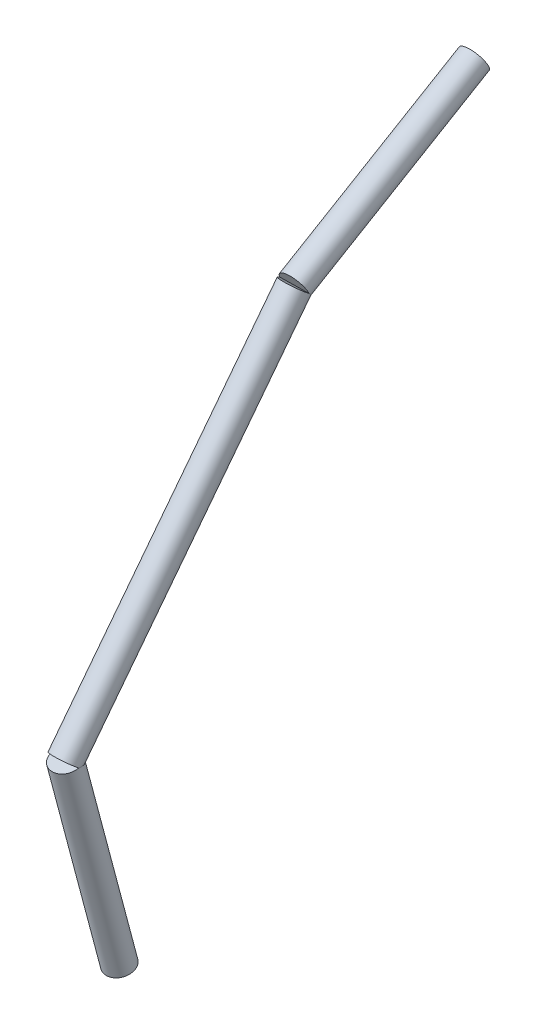
ISO-10303-21;
HEADER;
FILE_DESCRIPTION(('STEP AP214'),'2;1');
FILE_NAME('part.step','',(''),(''),'','','');
FILE_SCHEMA(('AUTOMOTIVE_DESIGN { 1 0 10303 214 1 1 1 1 }'));
ENDSEC;
DATA;
#1=APPLICATION_CONTEXT('core data for automotive mechanical design processes');
#2=APPLICATION_PROTOCOL_DEFINITION('international standard','automotive_design',2000,#1);
#3=PRODUCT_CONTEXT('',#1,'mechanical');
#4=PRODUCT('Part','Part','',(#3));
#5=PRODUCT_RELATED_PRODUCT_CATEGORY('part','',(#4));
#6=PRODUCT_DEFINITION_FORMATION('','',#4);
#7=PRODUCT_DEFINITION_CONTEXT('part definition',#1,'design');
#8=PRODUCT_DEFINITION('design','',#6,#7);
#9=PRODUCT_DEFINITION_SHAPE('','',#8);
#10=(LENGTH_UNIT() NAMED_UNIT(*) SI_UNIT(.MILLI.,.METRE.));
#11=(NAMED_UNIT(*) PLANE_ANGLE_UNIT() SI_UNIT($,.RADIAN.));
#12=(NAMED_UNIT(*) SI_UNIT($,.STERADIAN.) SOLID_ANGLE_UNIT());
#13=UNCERTAINTY_MEASURE_WITH_UNIT(LENGTH_MEASURE(1.E-05),#10,'distance_accuracy_value','');
#14=(GEOMETRIC_REPRESENTATION_CONTEXT(3) GLOBAL_UNCERTAINTY_ASSIGNED_CONTEXT((#13)) GLOBAL_UNIT_ASSIGNED_CONTEXT((#10,
#11,#12)) REPRESENTATION_CONTEXT('',''));
#15=CARTESIAN_POINT('',(0.,0.,0.));
#16=DIRECTION('',(0.,0.,1.));
#17=DIRECTION('',(1.,0.,0.));
#18=AXIS2_PLACEMENT_3D('',#15,#16,#17);
#19=CARTESIAN_POINT('',(0.,24.,70.));
#20=DIRECTION('',(0.0420048852601261,-0.458598241639988,0.887650405497004));
#21=DIRECTION('',(0.,-0.88843453308903,-0.459003355559497));
#22=AXIS2_PLACEMENT_3D('',#19,#20,#21);
#23=PLANE('',#22);
#24=CARTESIAN_POINT('',(0.,24.,70.));
#25=DIRECTION('',(-0.0420048852601261,0.458598241639988,-0.887650405497004));
#26=DIRECTION('',(0.,0.88843453308903,0.459003355559497));
#27=AXIS2_PLACEMENT_3D('',#24,#25,#26);
#28=CIRCLE('',#27,2.);
#29=CARTESIAN_POINT('',(0.,22.2231309338219,69.081993288881));
#30=VERTEX_POINT('',#29);
#31=EDGE_CURVE('P0_E10',#30,#30,#28,.T.);
#32=ORIENTED_EDGE('',*,*,#31,.F.);
#33=EDGE_LOOP('',(#32));
#34=FACE_BOUND('',#33,.T.);
#35=ADVANCED_FACE('P0_F15',(#34),#23,.T.);
#36=CARTESIAN_POINT('',(-1.325,38.466,42.));
#37=DIRECTION('',(-0.0420048852601261,0.458598241639988,-0.887650405497004));
#38=DIRECTION('',(0.,0.88843453308903,0.459003355559497));
#39=AXIS2_PLACEMENT_3D('',#36,#37,#38);
#40=PLANE('',#39);
#41=CARTESIAN_POINT('',(-1.325,38.466,42.));
#42=DIRECTION('',(0.0420048852601261,-0.458598241639988,0.887650405497004));
#43=DIRECTION('',(0.,-0.88843453308903,-0.459003355559497));
#44=AXIS2_PLACEMENT_3D('',#41,#42,#43);
#45=CIRCLE('',#44,2.);
#46=CARTESIAN_POINT('',(-1.325,36.6891309338219,41.081993288881));
#47=VERTEX_POINT('',#46);
#48=EDGE_CURVE('P0_E22',#47,#47,#45,.T.);
#49=ORIENTED_EDGE('',*,*,#48,.F.);
#50=EDGE_LOOP('',(#49));
#51=FACE_BOUND('',#50,.T.);
#52=ADVANCED_FACE('P0_F26',(#51),#40,.T.);
#53=CARTESIAN_POINT('',(-1.325,38.466,42.));
#54=DIRECTION('',(0.0420048852601261,-0.458598241639988,0.887650405497004));
#55=DIRECTION('',(0.,-0.88843453308903,-0.459003355559497));
#56=AXIS2_PLACEMENT_3D('',#53,#54,#55);
#57=CYLINDRICAL_SURFACE('',#56,2.);
#58=CARTESIAN_POINT('',(0.,22.2231309338219,69.081993288881));
#59=CARTESIAN_POINT('',(-0.0138020833333336,22.3738184338219,68.7903266222144));
#60=CARTESIAN_POINT('',(-0.0276041666666667,22.5245059338219,68.4986599555477));
#61=CARTESIAN_POINT('',(-0.0552083333333329,22.8258809338219,67.9153266222144));
#62=CARTESIAN_POINT('',(-0.0690104166666659,22.9765684338219,67.6236599555477));
#63=CARTESIAN_POINT('',(-0.0966145833333328,23.2779434338219,67.0403266222144));
#64=CARTESIAN_POINT('',(-0.110416666666667,23.4286309338219,66.7486599555477));
#65=CARTESIAN_POINT('',(-0.138020833333333,23.7300059338219,66.1653266222144));
#66=CARTESIAN_POINT('',(-0.151822916666666,23.8806934338219,65.8736599555477));
#67=CARTESIAN_POINT('',(-0.179427083333333,24.1820684338219,65.2903266222144));
#68=CARTESIAN_POINT('',(-0.193229166666666,24.3327559338219,64.9986599555477));
#69=CARTESIAN_POINT('',(-0.220833333333333,24.6341309338219,64.4153266222144));
#70=CARTESIAN_POINT('',(-0.234635416666667,24.7848184338219,64.1236599555477));
#71=CARTESIAN_POINT('',(-0.262239583333333,25.0861934338219,63.5403266222144));
#72=CARTESIAN_POINT('',(-0.276041666666666,25.2368809338219,63.2486599555477));
#73=CARTESIAN_POINT('',(-0.303645833333333,25.5382559338219,62.6653266222144));
#74=CARTESIAN_POINT('',(-0.317447916666666,25.6889434338219,62.3736599555477));
#75=CARTESIAN_POINT('',(-0.345052083333333,25.9903184338219,61.7903266222144));
#76=CARTESIAN_POINT('',(-0.358854166666666,26.1410059338219,61.4986599555477));
#77=CARTESIAN_POINT('',(-0.386458333333333,26.4423809338219,60.9153266222144));
#78=CARTESIAN_POINT('',(-0.400260416666666,26.5930684338219,60.6236599555477));
#79=CARTESIAN_POINT('',(-0.427864583333333,26.8944434338219,60.0403266222143));
#80=CARTESIAN_POINT('',(-0.441666666666666,27.0451309338219,59.7486599555477));
#81=CARTESIAN_POINT('',(-0.469270833333333,27.3465059338219,59.1653266222143));
#82=CARTESIAN_POINT('',(-0.483072916666666,27.4971934338219,58.8736599555477));
#83=CARTESIAN_POINT('',(-0.510677083333333,27.7985684338219,58.2903266222143));
#84=CARTESIAN_POINT('',(-0.524479166666666,27.9492559338219,57.9986599555477));
#85=CARTESIAN_POINT('',(-0.552083333333333,28.2506309338219,57.4153266222143));
#86=CARTESIAN_POINT('',(-0.565885416666666,28.4013184338219,57.1236599555477));
#87=CARTESIAN_POINT('',(-0.593489583333333,28.7026934338219,56.5403266222143));
#88=CARTESIAN_POINT('',(-0.607291666666666,28.8533809338219,56.2486599555477));
#89=CARTESIAN_POINT('',(-0.634895833333333,29.1547559338219,55.6653266222143));
#90=CARTESIAN_POINT('',(-0.648697916666666,29.3054434338219,55.3736599555477));
#91=CARTESIAN_POINT('',(-0.676302083333333,29.6068184338219,54.7903266222143));
#92=CARTESIAN_POINT('',(-0.690104166666666,29.7575059338219,54.4986599555477));
#93=CARTESIAN_POINT('',(-0.717708333333333,30.0588809338219,53.9153266222143));
#94=CARTESIAN_POINT('',(-0.731510416666666,30.2095684338219,53.6236599555477));
#95=CARTESIAN_POINT('',(-0.759114583333333,30.5109434338219,53.0403266222143));
#96=CARTESIAN_POINT('',(-0.772916666666666,30.6616309338219,52.7486599555477));
#97=CARTESIAN_POINT('',(-0.800520833333333,30.9630059338219,52.1653266222143));
#98=CARTESIAN_POINT('',(-0.814322916666666,31.1136934338219,51.8736599555477));
#99=CARTESIAN_POINT('',(-0.841927083333333,31.4150684338219,51.2903266222143));
#100=CARTESIAN_POINT('',(-0.855729166666666,31.5657559338219,50.9986599555477));
#101=CARTESIAN_POINT('',(-0.883333333333333,31.8671309338219,50.4153266222143));
#102=CARTESIAN_POINT('',(-0.897135416666666,32.0178184338219,50.1236599555477));
#103=CARTESIAN_POINT('',(-0.924739583333333,32.3191934338219,49.5403266222143));
#104=CARTESIAN_POINT('',(-0.938541666666666,32.4698809338219,49.2486599555477));
#105=CARTESIAN_POINT('',(-0.966145833333333,32.7712559338219,48.6653266222143));
#106=CARTESIAN_POINT('',(-0.979947916666666,32.9219434338219,48.3736599555477));
#107=CARTESIAN_POINT('',(-1.00755208333333,33.2233184338219,47.7903266222143));
#108=CARTESIAN_POINT('',(-1.02135416666667,33.3740059338219,47.4986599555477));
#109=CARTESIAN_POINT('',(-1.04895833333333,33.6753809338219,46.9153266222144));
#110=CARTESIAN_POINT('',(-1.06276041666667,33.8260684338219,46.6236599555477));
#111=CARTESIAN_POINT('',(-1.09036458333333,34.1274434338219,46.0403266222144));
#112=CARTESIAN_POINT('',(-1.10416666666667,34.2781309338219,45.7486599555477));
#113=CARTESIAN_POINT('',(-1.13177083333333,34.5795059338219,45.1653266222144));
#114=CARTESIAN_POINT('',(-1.14557291666667,34.7301934338219,44.8736599555477));
#115=CARTESIAN_POINT('',(-1.17317708333333,35.0315684338219,44.2903266222143));
#116=CARTESIAN_POINT('',(-1.18697916666667,35.1822559338219,43.9986599555477));
#117=CARTESIAN_POINT('',(-1.21458333333333,35.4836309338219,43.4153266222143));
#118=CARTESIAN_POINT('',(-1.22838541666667,35.6343184338219,43.1236599555477));
#119=CARTESIAN_POINT('',(-1.25598958333333,35.9356934338219,42.5403266222143));
#120=CARTESIAN_POINT('',(-1.26979166666667,36.0863809338219,42.2486599555477));
#121=CARTESIAN_POINT('',(-1.29739583333333,36.3877559338219,41.6653266222143));
#122=CARTESIAN_POINT('',(-1.31119791666667,36.5384434338219,41.3736599555477));
#123=CARTESIAN_POINT('',(-1.325,36.6891309338219,41.081993288881));
#124=B_SPLINE_CURVE_WITH_KNOTS('',3,(#58,#59,#60,#61,#62,#63,#64,#65,#66,#67,#68,#69,#70,#71,
#72,#73,#74,#75,#76,#77,#78,#79,#80,#81,#82,#83,#84,#85,#86,#87,#88,#89,#90,#91,#92,#93,#94,#95,
#96,#97,#98,#99,#100,#101,#102,#103,#104,#105,#106,#107,#108,#109,#110,#111,#112,#113,#114,#115,
#116,#117,#118,#119,#120,#121,#122,#123),.UNSPECIFIED.,.F.,.F.,(4,2,2,2,2,2,2,2,2,2,2,2,2,2,2,2,
2,2,2,2,2,2,2,2,2,2,2,2,2,2,2,2,4),(0.,0.985748437201544,1.97149687440312,2.95724531160466,
3.94299374880623,4.92874218600778,5.91449062320934,6.90023906041089,7.88598749761245,
8.87173593481401,9.85748437201557,10.8432328092171,11.8289812464187,12.8147296836202,
13.8004781208218,14.7862265580234,15.7719749952249,16.7577234324265,17.743471869628,
18.7292203068296,19.7149687440311,20.7007171812327,21.6864656184343,22.6722140556358,
23.6579624928374,24.6437109300389,25.6294593672405,26.615207804442,27.6009562416436,
28.5867046788452,29.5724531160467,30.5582015532483,31.5439499904498),.UNSPECIFIED.);
#125=EDGE_CURVE('P0_BSEAM17',#30,#47,#124,.T.);
#126=ORIENTED_EDGE('',*,*,#31,.T.);
#127=ORIENTED_EDGE('',*,*,#48,.T.);
#128=ORIENTED_EDGE('',*,*,#125,.T.);
#129=ORIENTED_EDGE('',*,*,#125,.F.);
#130=EDGE_LOOP('',(#126,#128,#127,#129));
#131=FACE_BOUND('',#130,.T.);
#132=ADVANCED_FACE('P0_F17',(#131),#57,.T.);
#133=CLOSED_SHELL('',(#35,#52,#132));
#134=MANIFOLD_SOLID_BREP('P0_B1',#133);
#135=CARTESIAN_POINT('',(0.,-20.,104.));
#136=DIRECTION('',(0.,-0.791285001392167,0.611447501075765));
#137=DIRECTION('',(0.,-0.611447501075765,-0.791285001392167));
#138=AXIS2_PLACEMENT_3D('',#135,#136,#137);
#139=PLANE('',#138);
#140=CARTESIAN_POINT('',(0.,-20.,104.));
#141=DIRECTION('',(0.,0.791285001392167,-0.611447501075765));
#142=DIRECTION('',(0.,0.611447501075765,0.791285001392167));
#143=AXIS2_PLACEMENT_3D('',#140,#141,#142);
#144=CIRCLE('',#143,2.);
#145=CARTESIAN_POINT('',(0.,-18.7771049978485,105.582570002784));
#146=VERTEX_POINT('',#145);
#147=EDGE_CURVE('P1_E10',#146,#146,#144,.T.);
#148=ORIENTED_EDGE('',*,*,#147,.F.);
#149=EDGE_LOOP('',(#148));
#150=FACE_BOUND('',#149,.T.);
#151=ADVANCED_FACE('P1_F15',(#150),#139,.T.);
#152=CARTESIAN_POINT('',(0.,24.,70.));
#153=DIRECTION('',(0.,0.791285001392167,-0.611447501075765));
#154=DIRECTION('',(0.,0.611447501075765,0.791285001392167));
#155=AXIS2_PLACEMENT_3D('',#152,#153,#154);
#156=PLANE('',#155);
#157=CARTESIAN_POINT('',(0.,24.,70.));
#158=DIRECTION('',(0.,-0.791285001392167,0.611447501075765));
#159=DIRECTION('',(0.,-0.611447501075765,-0.791285001392167));
#160=AXIS2_PLACEMENT_3D('',#157,#158,#159);
#161=CIRCLE('',#160,2.);
#162=CARTESIAN_POINT('',(0.,22.7771049978485,68.4174299972157));
#163=VERTEX_POINT('',#162);
#164=EDGE_CURVE('P1_E22',#163,#163,#161,.T.);
#165=ORIENTED_EDGE('',*,*,#164,.F.);
#166=EDGE_LOOP('',(#165));
#167=FACE_BOUND('',#166,.T.);
#168=ADVANCED_FACE('P1_F26',(#167),#156,.T.);
#169=CARTESIAN_POINT('',(0.,24.,70.));
#170=DIRECTION('',(0.,-0.791285001392167,0.611447501075765));
#171=DIRECTION('',(0.,-0.611447501075765,-0.791285001392167));
#172=AXIS2_PLACEMENT_3D('',#169,#170,#171);
#173=CYLINDRICAL_SURFACE('',#172,2.);
#174=ORIENTED_EDGE('',*,*,#147,.T.);
#175=EDGE_LOOP('',(#174));
#176=FACE_BOUND('',#175,.T.);
#177=ORIENTED_EDGE('',*,*,#164,.T.);
#178=EDGE_LOOP('',(#177));
#179=FACE_BOUND('',#178,.T.);
#180=ADVANCED_FACE('P1_F17',(#176,#179),#173,.T.);
#181=CLOSED_SHELL('',(#151,#168,#180));
#182=MANIFOLD_SOLID_BREP('P1_B1',#181);
#183=CARTESIAN_POINT('',(0.,-50.2081,95.968));
#184=DIRECTION('',(0.,-0.966421805644456,-0.256960879463994));
#185=DIRECTION('',(0.,0.256960879463994,-0.966421805644456));
#186=AXIS2_PLACEMENT_3D('',#183,#184,#185);
#187=PLANE('',#186);
#188=CARTESIAN_POINT('',(0.,-50.2081,95.968));
#189=DIRECTION('',(0.,0.966421805644456,0.256960879463994));
#190=DIRECTION('',(0.,-0.256960879463994,0.966421805644456));
#191=AXIS2_PLACEMENT_3D('',#188,#189,#190);
#192=CIRCLE('',#191,2.);
#193=CARTESIAN_POINT('',(0.,-50.722021758928,97.9008436112889));
#194=VERTEX_POINT('',#193);
#195=EDGE_CURVE('P2_E10',#194,#194,#192,.T.);
#196=ORIENTED_EDGE('',*,*,#195,.F.);
#197=EDGE_LOOP('',(#196));
#198=FACE_BOUND('',#197,.T.);
#199=ADVANCED_FACE('P2_F15',(#198),#187,.T.);
#200=CARTESIAN_POINT('',(0.,-20.,104.));
#201=DIRECTION('',(0.,0.966421805644456,0.256960879463994));
#202=DIRECTION('',(0.,-0.256960879463994,0.966421805644456));
#203=AXIS2_PLACEMENT_3D('',#200,#201,#202);
#204=PLANE('',#203);
#205=CARTESIAN_POINT('',(0.,-20.,104.));
#206=DIRECTION('',(0.,-0.966421805644456,-0.256960879463994));
#207=DIRECTION('',(0.,0.256960879463994,-0.966421805644456));
#208=AXIS2_PLACEMENT_3D('',#205,#206,#207);
#209=CIRCLE('',#208,2.);
#210=CARTESIAN_POINT('',(0.,-19.486078241072,102.067156388711));
#211=VERTEX_POINT('',#210);
#212=EDGE_CURVE('P2_E22',#211,#211,#209,.T.);
#213=ORIENTED_EDGE('',*,*,#212,.F.);
#214=EDGE_LOOP('',(#213));
#215=FACE_BOUND('',#214,.T.);
#216=ADVANCED_FACE('P2_F26',(#215),#204,.T.);
#217=CARTESIAN_POINT('',(0.,-20.,104.));
#218=DIRECTION('',(0.,-0.966421805644456,-0.256960879463994));
#219=DIRECTION('',(0.,0.256960879463994,-0.966421805644456));
#220=AXIS2_PLACEMENT_3D('',#217,#218,#219);
#221=CYLINDRICAL_SURFACE('',#220,2.);
#222=ORIENTED_EDGE('',*,*,#195,.T.);
#223=EDGE_LOOP('',(#222));
#224=FACE_BOUND('',#223,.T.);
#225=ORIENTED_EDGE('',*,*,#212,.T.);
#226=EDGE_LOOP('',(#225));
#227=FACE_BOUND('',#226,.T.);
#228=ADVANCED_FACE('P2_F17',(#224,#227),#221,.T.);
#229=CLOSED_SHELL('',(#199,#216,#228));
#230=MANIFOLD_SOLID_BREP('P2_B1',#229);
#231=ADVANCED_BREP_SHAPE_REPRESENTATION('',(#18,#134,#182,#230),#14);
#232=SHAPE_DEFINITION_REPRESENTATION(#9,#231);
ENDSEC;
END-ISO-10303-21;
